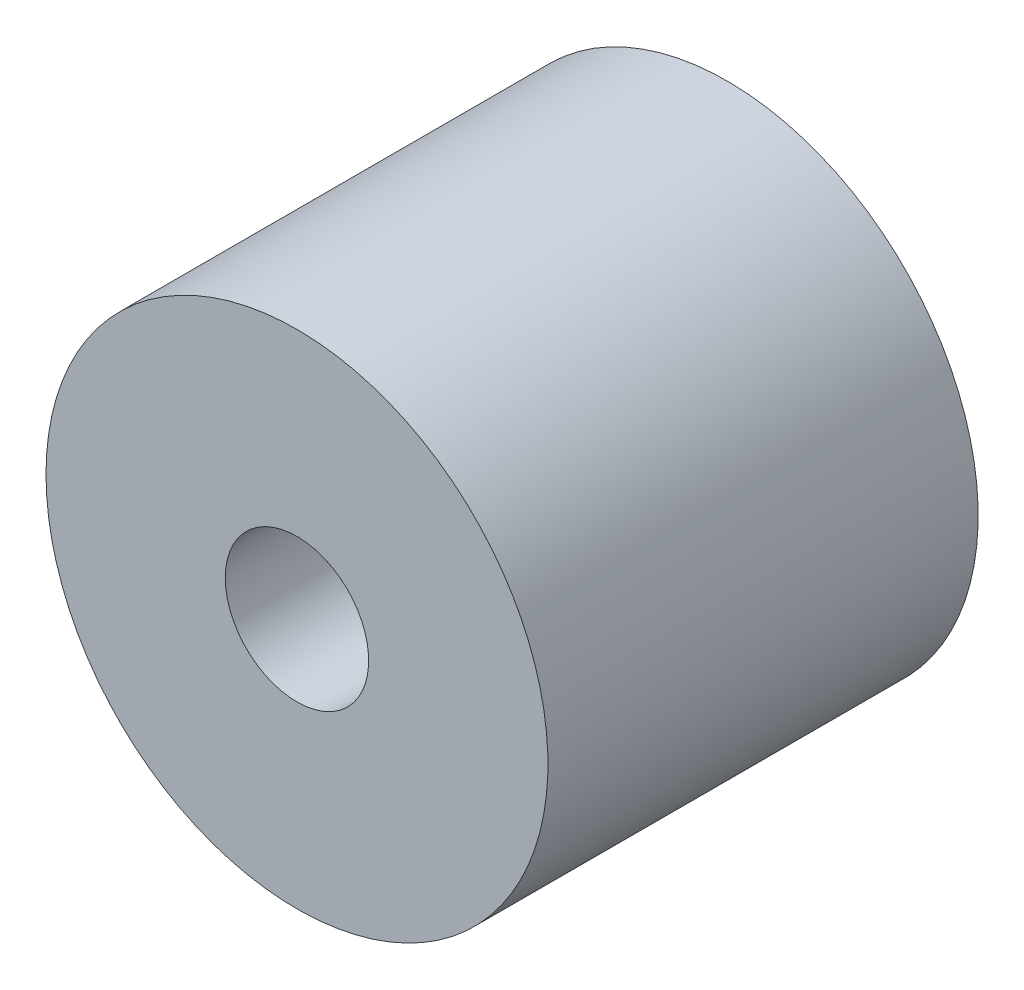
ISO-10303-21;
HEADER;
FILE_DESCRIPTION(('STEP AP214'),'2;1');
FILE_NAME('part.step','',(''),(''),'','','');
FILE_SCHEMA(('AUTOMOTIVE_DESIGN { 1 0 10303 214 1 1 1 1 }'));
ENDSEC;
DATA;
#1=APPLICATION_CONTEXT('core data for automotive mechanical design processes');
#2=APPLICATION_PROTOCOL_DEFINITION('international standard','automotive_design',2000,#1);
#3=PRODUCT_CONTEXT('',#1,'mechanical');
#4=PRODUCT('Part','Part','',(#3));
#5=PRODUCT_RELATED_PRODUCT_CATEGORY('part','',(#4));
#6=PRODUCT_DEFINITION_FORMATION('','',#4);
#7=PRODUCT_DEFINITION_CONTEXT('part definition',#1,'design');
#8=PRODUCT_DEFINITION('design','',#6,#7);
#9=PRODUCT_DEFINITION_SHAPE('','',#8);
#10=(LENGTH_UNIT() NAMED_UNIT(*) SI_UNIT(.MILLI.,.METRE.));
#11=(NAMED_UNIT(*) PLANE_ANGLE_UNIT() SI_UNIT($,.RADIAN.));
#12=(NAMED_UNIT(*) SI_UNIT($,.STERADIAN.) SOLID_ANGLE_UNIT());
#13=UNCERTAINTY_MEASURE_WITH_UNIT(LENGTH_MEASURE(1.E-05),#10,'distance_accuracy_value','');
#14=(GEOMETRIC_REPRESENTATION_CONTEXT(3) GLOBAL_UNCERTAINTY_ASSIGNED_CONTEXT((#13)) GLOBAL_UNIT_ASSIGNED_CONTEXT((#10,
#11,#12)) REPRESENTATION_CONTEXT('',''));
#15=CARTESIAN_POINT('',(0.,0.,0.));
#16=DIRECTION('',(0.,0.,1.));
#17=DIRECTION('',(1.,0.,0.));
#18=AXIS2_PLACEMENT_3D('',#15,#16,#17);
#19=CARTESIAN_POINT('',(0.,0.,0.));
#20=DIRECTION('',(0.,0.,-1.));
#21=DIRECTION('',(-1.,0.,0.));
#22=AXIS2_PLACEMENT_3D('',#19,#20,#21);
#23=CYLINDRICAL_SURFACE('',#22,2.);
#24=CARTESIAN_POINT('',(0.,0.,12.));
#25=DIRECTION('',(0.,0.,-1.));
#26=DIRECTION('',(-1.,0.,0.));
#27=AXIS2_PLACEMENT_3D('',#24,#25,#26);
#28=CIRCLE('',#27,2.);
#29=CARTESIAN_POINT('',(-2.,0.,12.));
#30=VERTEX_POINT('',#29);
#31=EDGE_CURVE('E10',#30,#30,#28,.T.);
#32=ORIENTED_EDGE('',*,*,#31,.F.);
#33=EDGE_LOOP('',(#32));
#34=FACE_BOUND('',#33,.T.);
#35=CARTESIAN_POINT('',(0.,0.,0.));
#36=DIRECTION('',(0.,0.,-1.));
#37=DIRECTION('',(-1.,0.,0.));
#38=AXIS2_PLACEMENT_3D('',#35,#36,#37);
#39=CIRCLE('',#38,2.);
#40=CARTESIAN_POINT('',(-2.,0.,0.));
#41=VERTEX_POINT('',#40);
#42=EDGE_CURVE('E54',#41,#41,#39,.T.);
#43=ORIENTED_EDGE('',*,*,#42,.T.);
#44=EDGE_LOOP('',(#43));
#45=FACE_BOUND('',#44,.T.);
#46=ADVANCED_FACE('F41',(#34,#45),#23,.F.);
#47=CARTESIAN_POINT('',(2.,0.,12.));
#48=DIRECTION('',(0.,0.,-1.));
#49=DIRECTION('',(-1.,0.,0.));
#50=AXIS2_PLACEMENT_3D('',#47,#48,#49);
#51=PLANE('',#50);
#52=CARTESIAN_POINT('',(0.,0.,12.));
#53=DIRECTION('',(0.,0.,-1.));
#54=DIRECTION('',(-1.,0.,0.));
#55=AXIS2_PLACEMENT_3D('',#52,#53,#54);
#56=CIRCLE('',#55,7.);
#57=CARTESIAN_POINT('',(-7.,0.,12.));
#58=VERTEX_POINT('',#57);
#59=EDGE_CURVE('E50',#58,#58,#56,.T.);
#60=ORIENTED_EDGE('',*,*,#59,.F.);
#61=EDGE_LOOP('',(#60));
#62=FACE_BOUND('',#61,.T.);
#63=ORIENTED_EDGE('',*,*,#31,.T.);
#64=EDGE_LOOP('',(#63));
#65=FACE_BOUND('',#64,.T.);
#66=ADVANCED_FACE('F70',(#62,#65),#51,.F.);
#67=CARTESIAN_POINT('',(0.,0.,0.));
#68=DIRECTION('',(0.,0.,-1.));
#69=DIRECTION('',(-1.,0.,0.));
#70=AXIS2_PLACEMENT_3D('',#67,#68,#69);
#71=CYLINDRICAL_SURFACE('',#70,7.);
#72=CARTESIAN_POINT('',(0.,0.,0.));
#73=DIRECTION('',(0.,0.,-1.));
#74=DIRECTION('',(-1.,0.,0.));
#75=AXIS2_PLACEMENT_3D('',#72,#73,#74);
#76=CIRCLE('',#75,7.);
#77=CARTESIAN_POINT('',(-7.,0.,0.));
#78=VERTEX_POINT('',#77);
#79=EDGE_CURVE('E51',#78,#78,#76,.T.);
#80=ORIENTED_EDGE('',*,*,#79,.F.);
#81=EDGE_LOOP('',(#80));
#82=FACE_BOUND('',#81,.T.);
#83=ORIENTED_EDGE('',*,*,#59,.T.);
#84=EDGE_LOOP('',(#83));
#85=FACE_BOUND('',#84,.T.);
#86=ADVANCED_FACE('F63',(#82,#85),#71,.T.);
#87=CARTESIAN_POINT('',(2.,0.,0.));
#88=DIRECTION('',(0.,0.,1.));
#89=DIRECTION('',(1.,0.,0.));
#90=AXIS2_PLACEMENT_3D('',#87,#88,#89);
#91=PLANE('',#90);
#92=ORIENTED_EDGE('',*,*,#42,.F.);
#93=EDGE_LOOP('',(#92));
#94=FACE_BOUND('',#93,.T.);
#95=ORIENTED_EDGE('',*,*,#79,.T.);
#96=EDGE_LOOP('',(#95));
#97=FACE_BOUND('',#96,.T.);
#98=ADVANCED_FACE('F65',(#94,#97),#91,.F.);
#99=CLOSED_SHELL('',(#46,#66,#86,#98));
#100=MANIFOLD_SOLID_BREP('B2',#99);
#101=ADVANCED_BREP_SHAPE_REPRESENTATION('',(#18,#100),#14);
#102=SHAPE_DEFINITION_REPRESENTATION(#9,#101);
ENDSEC;
END-ISO-10303-21;
